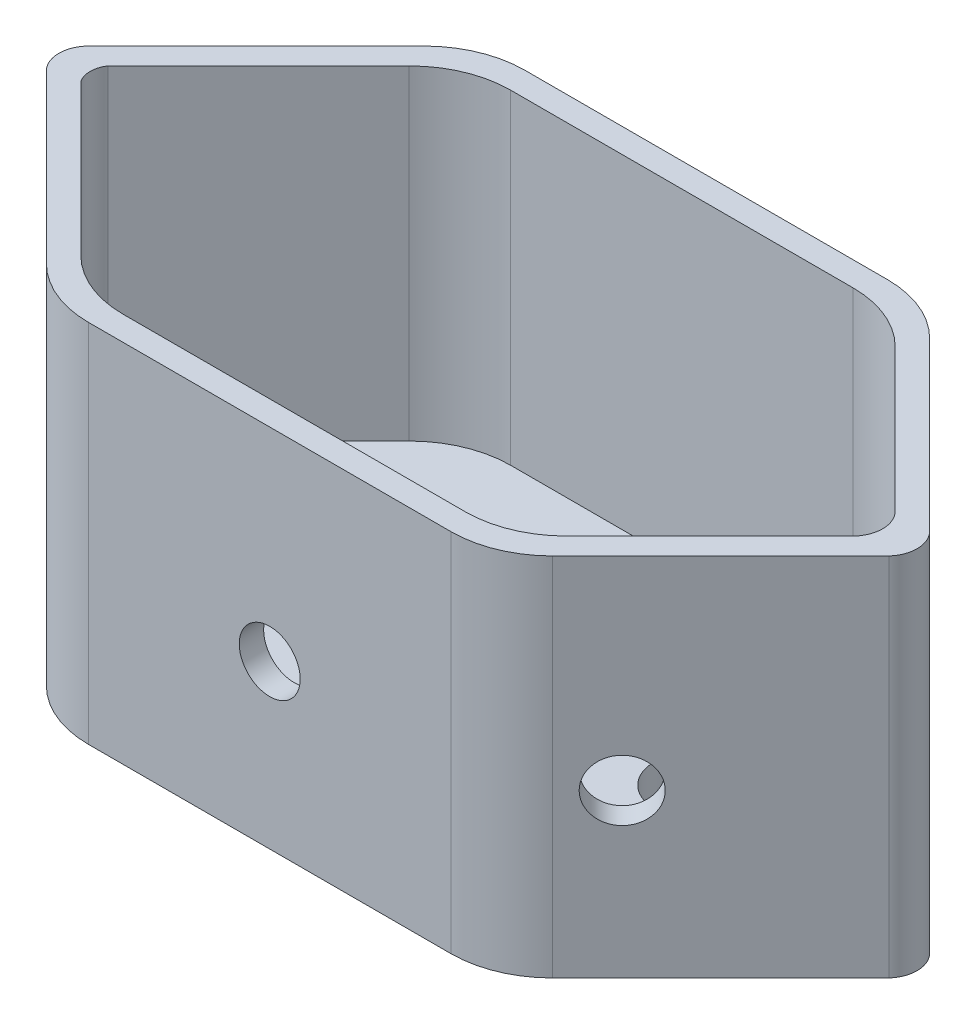
ISO-10303-21;
HEADER;
FILE_DESCRIPTION(('STEP AP214'),'2;1');
FILE_NAME('part.step','',(''),(''),'','','');
FILE_SCHEMA(('AUTOMOTIVE_DESIGN { 1 0 10303 214 1 1 1 1 }'));
ENDSEC;
DATA;
#1=APPLICATION_CONTEXT('core data for automotive mechanical design processes');
#2=APPLICATION_PROTOCOL_DEFINITION('international standard','automotive_design',2000,#1);
#3=PRODUCT_CONTEXT('',#1,'mechanical');
#4=PRODUCT('Part','Part','',(#3));
#5=PRODUCT_RELATED_PRODUCT_CATEGORY('part','',(#4));
#6=PRODUCT_DEFINITION_FORMATION('','',#4);
#7=PRODUCT_DEFINITION_CONTEXT('part definition',#1,'design');
#8=PRODUCT_DEFINITION('design','',#6,#7);
#9=PRODUCT_DEFINITION_SHAPE('','',#8);
#10=(LENGTH_UNIT() NAMED_UNIT(*) SI_UNIT(.MILLI.,.METRE.));
#11=(NAMED_UNIT(*) PLANE_ANGLE_UNIT() SI_UNIT($,.RADIAN.));
#12=(NAMED_UNIT(*) SI_UNIT($,.STERADIAN.) SOLID_ANGLE_UNIT());
#13=UNCERTAINTY_MEASURE_WITH_UNIT(LENGTH_MEASURE(1.E-05),#10,'distance_accuracy_value','');
#14=(GEOMETRIC_REPRESENTATION_CONTEXT(3) GLOBAL_UNCERTAINTY_ASSIGNED_CONTEXT((#13)) GLOBAL_UNIT_ASSIGNED_CONTEXT((#10,
#11,#12)) REPRESENTATION_CONTEXT('',''));
#15=CARTESIAN_POINT('',(0.,0.,0.));
#16=DIRECTION('',(0.,0.,1.));
#17=DIRECTION('',(1.,0.,0.));
#18=AXIS2_PLACEMENT_3D('',#15,#16,#17);
#19=CARTESIAN_POINT('',(8.92893218813522,18.,5.75000000000006));
#20=DIRECTION('',(0.,-1.,0.));
#21=DIRECTION('',(0.,0.,-1.));
#22=AXIS2_PLACEMENT_3D('',#19,#20,#21);
#23=CYLINDRICAL_SURFACE('',#22,5.);
#24=DIRECTION('',(0.,-1.,0.));
#25=VECTOR('',#24,1.);
#26=CARTESIAN_POINT('',(12.464466094068,18.,9.28553390593277));
#27=LINE('',#26,#25);
#28=CARTESIAN_POINT('',(12.464466094068,18.,9.28553390593277));
#29=VERTEX_POINT('',#28);
#30=CARTESIAN_POINT('',(12.464466094068,0.,9.28553390593277));
#31=VERTEX_POINT('',#30);
#32=EDGE_CURVE('E383',#29,#31,#27,.T.);
#33=ORIENTED_EDGE('',*,*,#32,.F.);
#34=CARTESIAN_POINT('',(8.92893218813522,18.,5.75000000000006));
#35=DIRECTION('',(0.,1.,0.));
#36=DIRECTION('',(0.,0.,1.));
#37=AXIS2_PLACEMENT_3D('',#34,#35,#36);
#38=CIRCLE('',#37,5.);
#39=CARTESIAN_POINT('',(8.92893218813522,18.,10.7500000000001));
#40=VERTEX_POINT('',#39);
#41=EDGE_CURVE('E41',#40,#29,#38,.T.);
#42=ORIENTED_EDGE('',*,*,#41,.F.);
#43=DIRECTION('',(0.,-1.,0.));
#44=VECTOR('',#43,1.);
#45=CARTESIAN_POINT('',(8.92893218813522,18.,10.7500000000001));
#46=LINE('',#45,#44);
#47=CARTESIAN_POINT('',(8.92893218813522,0.,10.7500000000001));
#48=VERTEX_POINT('',#47);
#49=EDGE_CURVE('E386',#48,#40,#46,.F.);
#50=ORIENTED_EDGE('',*,*,#49,.F.);
#51=CARTESIAN_POINT('',(8.92893218813522,0.,5.75000000000006));
#52=DIRECTION('',(0.,1.,0.));
#53=DIRECTION('',(0.,0.,1.));
#54=AXIS2_PLACEMENT_3D('',#51,#52,#53);
#55=CIRCLE('',#54,5.);
#56=EDGE_CURVE('E11',#31,#48,#55,.F.);
#57=ORIENTED_EDGE('',*,*,#56,.F.);
#58=EDGE_LOOP('',(#33,#42,#50,#57));
#59=FACE_BOUND('',#58,.T.);
#60=ADVANCED_FACE('F34',(#59),#23,.T.);
#61=CARTESIAN_POINT('',(-8.92893218813382,18.,5.75000000000006));
#62=DIRECTION('',(0.,-1.,0.));
#63=DIRECTION('',(0.,0.,-1.));
#64=AXIS2_PLACEMENT_3D('',#61,#62,#63);
#65=CYLINDRICAL_SURFACE('',#64,5.);
#66=DIRECTION('',(0.,-1.,0.));
#67=VECTOR('',#66,1.);
#68=CARTESIAN_POINT('',(-8.92893218813382,18.,10.7500000000001));
#69=LINE('',#68,#67);
#70=CARTESIAN_POINT('',(-8.92893218813382,18.,10.7500000000001));
#71=VERTEX_POINT('',#70);
#72=CARTESIAN_POINT('',(-8.92893218813382,0.,10.7500000000001));
#73=VERTEX_POINT('',#72);
#74=EDGE_CURVE('E373',#71,#73,#69,.T.);
#75=ORIENTED_EDGE('',*,*,#74,.F.);
#76=CARTESIAN_POINT('',(-8.92893218813382,18.,5.75000000000006));
#77=DIRECTION('',(0.,1.,0.));
#78=DIRECTION('',(0.,0.,1.));
#79=AXIS2_PLACEMENT_3D('',#76,#77,#78);
#80=CIRCLE('',#79,5.);
#81=CARTESIAN_POINT('',(-12.4644660940665,18.,9.28553390593282));
#82=VERTEX_POINT('',#81);
#83=EDGE_CURVE('E379',#82,#71,#80,.T.);
#84=ORIENTED_EDGE('',*,*,#83,.F.);
#85=DIRECTION('',(0.,-1.,0.));
#86=VECTOR('',#85,1.);
#87=CARTESIAN_POINT('',(-12.4644660940665,18.,9.28553390593282));
#88=LINE('',#87,#86);
#89=CARTESIAN_POINT('',(-12.4644660940665,0.,9.28553390593282));
#90=VERTEX_POINT('',#89);
#91=EDGE_CURVE('E376',#90,#82,#88,.F.);
#92=ORIENTED_EDGE('',*,*,#91,.F.);
#93=CARTESIAN_POINT('',(-8.92893218813382,0.,5.75000000000006));
#94=DIRECTION('',(0.,1.,0.));
#95=DIRECTION('',(0.,0.,1.));
#96=AXIS2_PLACEMENT_3D('',#93,#94,#95);
#97=CIRCLE('',#96,5.);
#98=EDGE_CURVE('E381',#73,#90,#97,.F.);
#99=ORIENTED_EDGE('',*,*,#98,.F.);
#100=EDGE_LOOP('',(#75,#84,#92,#99));
#101=FACE_BOUND('',#100,.T.);
#102=ADVANCED_FACE('F429',(#101),#65,.T.);
#103=CARTESIAN_POINT('',(8.92893218813454,18.,-5.74999999999998));
#104=DIRECTION('',(0.,1.,0.));
#105=DIRECTION('',(0.,0.,1.));
#106=AXIS2_PLACEMENT_3D('',#103,#104,#105);
#107=CYLINDRICAL_SURFACE('',#106,5.);
#108=DIRECTION('',(0.,-1.,0.));
#109=VECTOR('',#108,1.);
#110=CARTESIAN_POINT('',(8.92893218813453,18.,-10.75));
#111=LINE('',#110,#109);
#112=CARTESIAN_POINT('',(8.92893218813453,18.,-10.75));
#113=VERTEX_POINT('',#112);
#114=CARTESIAN_POINT('',(8.92893218813453,0.,-10.75));
#115=VERTEX_POINT('',#114);
#116=EDGE_CURVE('E363',#113,#115,#111,.T.);
#117=ORIENTED_EDGE('',*,*,#116,.F.);
#118=CARTESIAN_POINT('',(8.92893218813454,18.,-5.74999999999998));
#119=DIRECTION('',(0.,1.,0.));
#120=DIRECTION('',(0.,0.,1.));
#121=AXIS2_PLACEMENT_3D('',#118,#119,#120);
#122=CIRCLE('',#121,5.);
#123=CARTESIAN_POINT('',(12.4644660940673,18.,-9.28553390593274));
#124=VERTEX_POINT('',#123);
#125=EDGE_CURVE('E369',#124,#113,#122,.T.);
#126=ORIENTED_EDGE('',*,*,#125,.F.);
#127=DIRECTION('',(0.,-1.,0.));
#128=VECTOR('',#127,1.);
#129=CARTESIAN_POINT('',(12.4644660940673,18.,-9.28553390593274));
#130=LINE('',#129,#128);
#131=CARTESIAN_POINT('',(12.4644660940673,0.,-9.28553390593274));
#132=VERTEX_POINT('',#131);
#133=EDGE_CURVE('E366',#132,#124,#130,.F.);
#134=ORIENTED_EDGE('',*,*,#133,.F.);
#135=CARTESIAN_POINT('',(8.92893218813454,0.,-5.74999999999998));
#136=DIRECTION('',(0.,1.,0.));
#137=DIRECTION('',(0.,0.,1.));
#138=AXIS2_PLACEMENT_3D('',#135,#136,#137);
#139=CIRCLE('',#138,5.);
#140=EDGE_CURVE('E371',#115,#132,#139,.F.);
#141=ORIENTED_EDGE('',*,*,#140,.F.);
#142=EDGE_LOOP('',(#117,#126,#134,#141));
#143=FACE_BOUND('',#142,.T.);
#144=ADVANCED_FACE('F406',(#143),#107,.T.);
#145=CARTESIAN_POINT('',(-8.92893218813485,18.,-5.74999999999995));
#146=DIRECTION('',(0.,1.,0.));
#147=DIRECTION('',(0.,0.,1.));
#148=AXIS2_PLACEMENT_3D('',#145,#146,#147);
#149=CYLINDRICAL_SURFACE('',#148,5.);
#150=DIRECTION('',(0.,1.,0.));
#151=VECTOR('',#150,1.);
#152=CARTESIAN_POINT('',(-8.92893218813486,18.,-10.7499999999999));
#153=LINE('',#152,#151);
#154=CARTESIAN_POINT('',(-8.92893218813486,0.,-10.7499999999999));
#155=VERTEX_POINT('',#154);
#156=CARTESIAN_POINT('',(-8.92893218813486,18.,-10.7499999999999));
#157=VERTEX_POINT('',#156);
#158=EDGE_CURVE('E353',#155,#157,#153,.T.);
#159=ORIENTED_EDGE('',*,*,#158,.F.);
#160=CARTESIAN_POINT('',(-8.92893218813485,0.,-5.74999999999995));
#161=DIRECTION('',(0.,1.,0.));
#162=DIRECTION('',(0.,0.,1.));
#163=AXIS2_PLACEMENT_3D('',#160,#161,#162);
#164=CIRCLE('',#163,5.);
#165=CARTESIAN_POINT('',(-12.4644660940676,0.,-9.28553390593266));
#166=VERTEX_POINT('',#165);
#167=EDGE_CURVE('E359',#166,#155,#164,.F.);
#168=ORIENTED_EDGE('',*,*,#167,.F.);
#169=DIRECTION('',(0.,1.,0.));
#170=VECTOR('',#169,1.);
#171=CARTESIAN_POINT('',(-12.4644660940676,18.,-9.28553390593266));
#172=LINE('',#171,#170);
#173=CARTESIAN_POINT('',(-12.4644660940676,18.,-9.28553390593266));
#174=VERTEX_POINT('',#173);
#175=EDGE_CURVE('E356',#174,#166,#172,.F.);
#176=ORIENTED_EDGE('',*,*,#175,.F.);
#177=CARTESIAN_POINT('',(-8.92893218813485,18.,-5.74999999999995));
#178=DIRECTION('',(0.,1.,0.));
#179=DIRECTION('',(0.,0.,1.));
#180=AXIS2_PLACEMENT_3D('',#177,#178,#179);
#181=CIRCLE('',#180,5.);
#182=EDGE_CURVE('E361',#157,#174,#181,.T.);
#183=ORIENTED_EDGE('',*,*,#182,.F.);
#184=EDGE_LOOP('',(#159,#168,#176,#183));
#185=FACE_BOUND('',#184,.T.);
#186=ADVANCED_FACE('F415',(#185),#149,.T.);
#187=CARTESIAN_POINT('',(8.43187591328753,2.,4.55000000000006));
#188=DIRECTION('',(0.,-1.,0.));
#189=DIRECTION('',(0.,0.,-1.));
#190=AXIS2_PLACEMENT_3D('',#187,#188,#189);
#191=CYLINDRICAL_SURFACE('',#190,5.);
#192=DIRECTION('',(0.,-1.,0.));
#193=VECTOR('',#192,1.);
#194=CARTESIAN_POINT('',(8.43187591328753,2.,9.55000000000006));
#195=LINE('',#194,#193);
#196=CARTESIAN_POINT('',(8.43187591328753,18.,9.55000000000006));
#197=VERTEX_POINT('',#196);
#198=CARTESIAN_POINT('',(8.43187591328753,2.,9.55000000000006));
#199=VERTEX_POINT('',#198);
#200=EDGE_CURVE('E343',#197,#199,#195,.T.);
#201=ORIENTED_EDGE('',*,*,#200,.F.);
#202=CARTESIAN_POINT('',(8.43187591328753,18.,4.55000000000006));
#203=DIRECTION('',(0.,1.,0.));
#204=DIRECTION('',(0.,0.,1.));
#205=AXIS2_PLACEMENT_3D('',#202,#203,#204);
#206=CIRCLE('',#205,5.);
#207=CARTESIAN_POINT('',(11.9674098192203,18.,8.0855339059328));
#208=VERTEX_POINT('',#207);
#209=EDGE_CURVE('E351',#197,#208,#206,.T.);
#210=ORIENTED_EDGE('',*,*,#209,.T.);
#211=DIRECTION('',(0.,-1.,0.));
#212=VECTOR('',#211,1.);
#213=CARTESIAN_POINT('',(11.9674098192203,2.,8.08553390593279));
#214=LINE('',#213,#212);
#215=CARTESIAN_POINT('',(11.9674098192203,2.,8.0855339059328));
#216=VERTEX_POINT('',#215);
#217=EDGE_CURVE('E346',#216,#208,#214,.F.);
#218=ORIENTED_EDGE('',*,*,#217,.F.);
#219=CARTESIAN_POINT('',(8.43187591328753,2.,4.55000000000006));
#220=DIRECTION('',(0.,1.,0.));
#221=DIRECTION('',(0.,0.,1.));
#222=AXIS2_PLACEMENT_3D('',#219,#220,#221);
#223=CIRCLE('',#222,5.);
#224=EDGE_CURVE('E349',#199,#216,#223,.T.);
#225=ORIENTED_EDGE('',*,*,#224,.F.);
#226=EDGE_LOOP('',(#201,#210,#218,#225));
#227=FACE_BOUND('',#226,.T.);
#228=ADVANCED_FACE('F457',(#227),#191,.F.);
#229=CARTESIAN_POINT('',(-8.43187591328621,2.,4.55000000000006));
#230=DIRECTION('',(0.,-1.,0.));
#231=DIRECTION('',(0.,0.,-1.));
#232=AXIS2_PLACEMENT_3D('',#229,#230,#231);
#233=CYLINDRICAL_SURFACE('',#232,5.);
#234=DIRECTION('',(0.,-1.,0.));
#235=VECTOR('',#234,1.);
#236=CARTESIAN_POINT('',(-11.9674098192189,2.,8.0855339059328));
#237=LINE('',#236,#235);
#238=CARTESIAN_POINT('',(-11.9674098192189,18.,8.0855339059328));
#239=VERTEX_POINT('',#238);
#240=CARTESIAN_POINT('',(-11.9674098192189,2.,8.0855339059328));
#241=VERTEX_POINT('',#240);
#242=EDGE_CURVE('E333',#239,#241,#237,.T.);
#243=ORIENTED_EDGE('',*,*,#242,.F.);
#244=CARTESIAN_POINT('',(-8.43187591328621,18.,4.55000000000006));
#245=DIRECTION('',(0.,1.,0.));
#246=DIRECTION('',(0.,0.,1.));
#247=AXIS2_PLACEMENT_3D('',#244,#245,#246);
#248=CIRCLE('',#247,5.);
#249=CARTESIAN_POINT('',(-8.43187591328621,18.,9.55000000000006));
#250=VERTEX_POINT('',#249);
#251=EDGE_CURVE('E341',#239,#250,#248,.T.);
#252=ORIENTED_EDGE('',*,*,#251,.T.);
#253=DIRECTION('',(0.,-1.,0.));
#254=VECTOR('',#253,1.);
#255=CARTESIAN_POINT('',(-8.43187591328621,2.,9.55000000000006));
#256=LINE('',#255,#254);
#257=CARTESIAN_POINT('',(-8.43187591328621,2.,9.55000000000006));
#258=VERTEX_POINT('',#257);
#259=EDGE_CURVE('E336',#258,#250,#256,.F.);
#260=ORIENTED_EDGE('',*,*,#259,.F.);
#261=CARTESIAN_POINT('',(-8.43187591328621,2.,4.55000000000006));
#262=DIRECTION('',(0.,1.,0.));
#263=DIRECTION('',(0.,0.,1.));
#264=AXIS2_PLACEMENT_3D('',#261,#262,#263);
#265=CIRCLE('',#264,5.);
#266=EDGE_CURVE('E339',#241,#258,#265,.T.);
#267=ORIENTED_EDGE('',*,*,#266,.F.);
#268=EDGE_LOOP('',(#243,#252,#260,#267));
#269=FACE_BOUND('',#268,.T.);
#270=ADVANCED_FACE('F460',(#269),#233,.F.);
#271=CARTESIAN_POINT('',(8.43187591328693,2.,-4.54999999999994));
#272=DIRECTION('',(0.,-1.,0.));
#273=DIRECTION('',(0.,0.,-1.));
#274=AXIS2_PLACEMENT_3D('',#271,#272,#273);
#275=CYLINDRICAL_SURFACE('',#274,5.);
#276=DIRECTION('',(0.,1.,0.));
#277=VECTOR('',#276,1.);
#278=CARTESIAN_POINT('',(8.43187591328693,2.,-9.54999999999994));
#279=LINE('',#278,#277);
#280=CARTESIAN_POINT('',(8.43187591328693,2.,-9.54999999999994));
#281=VERTEX_POINT('',#280);
#282=CARTESIAN_POINT('',(8.43187591328693,18.,-9.54999999999994));
#283=VERTEX_POINT('',#282);
#284=EDGE_CURVE('E325',#281,#283,#279,.T.);
#285=ORIENTED_EDGE('',*,*,#284,.F.);
#286=CARTESIAN_POINT('',(8.43187591328693,2.,-4.54999999999994));
#287=DIRECTION('',(0.,1.,0.));
#288=DIRECTION('',(0.,0.,1.));
#289=AXIS2_PLACEMENT_3D('',#286,#287,#288);
#290=CIRCLE('',#289,5.);
#291=CARTESIAN_POINT('',(11.9674098192197,2.,-8.08553390593268));
#292=VERTEX_POINT('',#291);
#293=EDGE_CURVE('E329',#292,#281,#290,.T.);
#294=ORIENTED_EDGE('',*,*,#293,.F.);
#295=DIRECTION('',(0.,1.,0.));
#296=VECTOR('',#295,1.);
#297=CARTESIAN_POINT('',(11.9674098192197,2.,-8.08553390593268));
#298=LINE('',#297,#296);
#299=CARTESIAN_POINT('',(11.9674098192197,18.,-8.08553390593268));
#300=VERTEX_POINT('',#299);
#301=EDGE_CURVE('E218',#300,#292,#298,.F.);
#302=ORIENTED_EDGE('',*,*,#301,.F.);
#303=CARTESIAN_POINT('',(8.43187591328693,18.,-4.54999999999994));
#304=DIRECTION('',(0.,1.,0.));
#305=DIRECTION('',(0.,0.,1.));
#306=AXIS2_PLACEMENT_3D('',#303,#304,#305);
#307=CIRCLE('',#306,5.);
#308=EDGE_CURVE('E331',#300,#283,#307,.T.);
#309=ORIENTED_EDGE('',*,*,#308,.T.);
#310=EDGE_LOOP('',(#285,#294,#302,#309));
#311=FACE_BOUND('',#310,.T.);
#312=ADVANCED_FACE('F464',(#311),#275,.F.);
#313=CARTESIAN_POINT('',(-8.43187591328704,2.,-4.54999999999994));
#314=DIRECTION('',(0.,-1.,0.));
#315=DIRECTION('',(0.,0.,-1.));
#316=AXIS2_PLACEMENT_3D('',#313,#314,#315);
#317=CYLINDRICAL_SURFACE('',#316,5.);
#318=DIRECTION('',(0.,-1.,0.));
#319=VECTOR('',#318,1.);
#320=CARTESIAN_POINT('',(-8.43187591328704,2.,-9.54999999999994));
#321=LINE('',#320,#319);
#322=CARTESIAN_POINT('',(-8.43187591328704,18.,-9.54999999999994));
#323=VERTEX_POINT('',#322);
#324=CARTESIAN_POINT('',(-8.43187591328704,2.,-9.54999999999994));
#325=VERTEX_POINT('',#324);
#326=EDGE_CURVE('E315',#323,#325,#321,.T.);
#327=ORIENTED_EDGE('',*,*,#326,.F.);
#328=CARTESIAN_POINT('',(-8.43187591328704,18.,-4.54999999999994));
#329=DIRECTION('',(0.,1.,0.));
#330=DIRECTION('',(0.,0.,1.));
#331=AXIS2_PLACEMENT_3D('',#328,#329,#330);
#332=CIRCLE('',#331,5.);
#333=CARTESIAN_POINT('',(-11.9674098192198,18.,-8.08553390593268));
#334=VERTEX_POINT('',#333);
#335=EDGE_CURVE('E323',#323,#334,#332,.T.);
#336=ORIENTED_EDGE('',*,*,#335,.T.);
#337=DIRECTION('',(0.,-1.,0.));
#338=VECTOR('',#337,1.);
#339=CARTESIAN_POINT('',(-11.9674098192198,2.,-8.08553390593268));
#340=LINE('',#339,#338);
#341=CARTESIAN_POINT('',(-11.9674098192198,2.,-8.08553390593268));
#342=VERTEX_POINT('',#341);
#343=EDGE_CURVE('E318',#342,#334,#340,.F.);
#344=ORIENTED_EDGE('',*,*,#343,.F.);
#345=CARTESIAN_POINT('',(-8.43187591328704,2.,-4.54999999999994));
#346=DIRECTION('',(0.,1.,0.));
#347=DIRECTION('',(0.,0.,1.));
#348=AXIS2_PLACEMENT_3D('',#345,#346,#347);
#349=CIRCLE('',#348,5.);
#350=EDGE_CURVE('E321',#325,#342,#349,.T.);
#351=ORIENTED_EDGE('',*,*,#350,.F.);
#352=EDGE_LOOP('',(#327,#336,#344,#351));
#353=FACE_BOUND('',#352,.T.);
#354=ADVANCED_FACE('F468',(#353),#317,.F.);
#355=CARTESIAN_POINT('',(0.,18.,0.));
#356=DIRECTION('',(0.,1.,0.));
#357=DIRECTION('',(0.,0.,1.));
#358=AXIS2_PLACEMENT_3D('',#355,#356,#357);
#359=PLANE('',#358);
#360=ORIENTED_EDGE('',*,*,#251,.F.);
#361=DIRECTION('',(-0.707106781186548,0.,-0.707106781186547));
#362=VECTOR('',#361,1.);
#363=CARTESIAN_POINT('',(-10.0264718625759,18.,10.0264718625759));
#364=LINE('',#363,#362);
#365=CARTESIAN_POINT('',(-19.389618767081,18.,0.663324958070733));
#366=VERTEX_POINT('',#365);
#367=EDGE_CURVE('E247',#239,#366,#364,.T.);
#368=ORIENTED_EDGE('',*,*,#367,.T.);
#369=CARTESIAN_POINT('',(-18.389618767081,18.,-3.56702514747731E-13));
#370=DIRECTION('',(0.,1.,0.));
#371=DIRECTION('',(0.,0.,1.));
#372=AXIS2_PLACEMENT_3D('',#369,#370,#371);
#373=CIRCLE('',#372,1.2);
#374=CARTESIAN_POINT('',(-19.389618767081,18.,-0.663324958071436));
#375=VERTEX_POINT('',#374);
#376=EDGE_CURVE('E244',#375,#366,#373,.T.);
#377=ORIENTED_EDGE('',*,*,#376,.F.);
#378=DIRECTION('',(0.707106781186548,0.,-0.707106781186547));
#379=VECTOR('',#378,1.);
#380=CARTESIAN_POINT('',(-10.0264718625762,18.,-10.0264718625762));
#381=LINE('',#380,#379);
#382=EDGE_CURVE('E241',#375,#334,#381,.T.);
#383=ORIENTED_EDGE('',*,*,#382,.T.);
#384=ORIENTED_EDGE('',*,*,#335,.F.);
#385=DIRECTION('',(-1.,0.,0.));
#386=VECTOR('',#385,1.);
#387=CARTESIAN_POINT('',(0.,18.,-9.54999999999994));
#388=LINE('',#387,#386);
#389=EDGE_CURVE('E239',#283,#323,#388,.T.);
#390=ORIENTED_EDGE('',*,*,#389,.F.);
#391=ORIENTED_EDGE('',*,*,#308,.F.);
#392=DIRECTION('',(-0.707106781186548,0.,-0.707106781186548));
#393=VECTOR('',#392,1.);
#394=CARTESIAN_POINT('',(10.0264718625762,18.,-10.0264718625762));
#395=LINE('',#394,#393);
#396=CARTESIAN_POINT('',(19.0529437251527,18.,-0.999999999999645));
#397=VERTEX_POINT('',#396);
#398=EDGE_CURVE('E236',#397,#300,#395,.T.);
#399=ORIENTED_EDGE('',*,*,#398,.F.);
#400=CARTESIAN_POINT('',(17.9349097364028,18.,3.55076211489003E-13));
#401=DIRECTION('',(0.,1.,0.));
#402=DIRECTION('',(0.,0.,1.));
#403=AXIS2_PLACEMENT_3D('',#400,#401,#402);
#404=CIRCLE('',#403,1.5);
#405=CARTESIAN_POINT('',(19.0529437251527,18.,1.00000000000035));
#406=VERTEX_POINT('',#405);
#407=EDGE_CURVE('E199',#397,#406,#404,.F.);
#408=ORIENTED_EDGE('',*,*,#407,.T.);
#409=DIRECTION('',(-0.707106781186547,0.,0.707106781186548));
#410=VECTOR('',#409,1.);
#411=CARTESIAN_POINT('',(10.0264718625765,18.,10.0264718625765));
#412=LINE('',#411,#410);
#413=EDGE_CURVE('E213',#406,#208,#412,.T.);
#414=ORIENTED_EDGE('',*,*,#413,.T.);
#415=ORIENTED_EDGE('',*,*,#209,.F.);
#416=DIRECTION('',(1.,0.,0.));
#417=VECTOR('',#416,1.);
#418=CARTESIAN_POINT('',(0.,18.,9.55000000000006));
#419=LINE('',#418,#417);
#420=EDGE_CURVE('E249',#250,#197,#419,.T.);
#421=ORIENTED_EDGE('',*,*,#420,.F.);
#422=EDGE_LOOP('',(#360,#368,#377,#383,#384,#390,#391,#399,#408,#414,#415,#421));
#423=FACE_BOUND('',#422,.T.);
#424=DIRECTION('',(1.,0.,0.));
#425=VECTOR('',#424,1.);
#426=CARTESIAN_POINT('',(0.,18.,10.7500000000001));
#427=LINE('',#426,#425);
#428=EDGE_CURVE('E268',#71,#40,#427,.T.);
#429=ORIENTED_EDGE('',*,*,#428,.T.);
#430=ORIENTED_EDGE('',*,*,#41,.T.);
#431=DIRECTION('',(0.707106781186543,0.,-0.707106781186552));
#432=VECTOR('',#431,1.);
#433=CARTESIAN_POINT('',(10.8750000000005,18.,10.8750000000003));
#434=LINE('',#433,#432);
#435=CARTESIAN_POINT('',(20.750111132589,18.,0.999888867411659));
#436=VERTEX_POINT('',#435);
#437=EDGE_CURVE('E271',#29,#436,#434,.T.);
#438=ORIENTED_EDGE('',*,*,#437,.T.);
#439=CARTESIAN_POINT('',(19.6319660112503,18.,0.));
#440=DIRECTION('',(0.,1.,0.));
#441=DIRECTION('',(0.,0.,1.));
#442=AXIS2_PLACEMENT_3D('',#439,#440,#441);
#443=CIRCLE('',#442,1.50000000000017);
#444=CARTESIAN_POINT('',(20.7500000000002,18.,-0.999999999999879));
#445=VERTEX_POINT('',#444);
#446=EDGE_CURVE('E273',#445,#436,#443,.F.);
#447=ORIENTED_EDGE('',*,*,#446,.F.);
#448=DIRECTION('',(-0.70710678118655,0.,-0.707106781186545));
#449=VECTOR('',#448,1.);
#450=CARTESIAN_POINT('',(10.875,18.,-10.875));
#451=LINE('',#450,#449);
#452=EDGE_CURVE('E276',#445,#124,#451,.T.);
#453=ORIENTED_EDGE('',*,*,#452,.T.);
#454=ORIENTED_EDGE('',*,*,#125,.T.);
#455=DIRECTION('',(1.,0.,0.));
#456=VECTOR('',#455,1.);
#457=CARTESIAN_POINT('',(0.,18.,-10.75));
#458=LINE('',#457,#456);
#459=EDGE_CURVE('E279',#157,#113,#458,.T.);
#460=ORIENTED_EDGE('',*,*,#459,.F.);
#461=ORIENTED_EDGE('',*,*,#182,.T.);
#462=DIRECTION('',(0.707106781186543,0.,-0.707106781186552));
#463=VECTOR('',#462,1.);
#464=CARTESIAN_POINT('',(-10.8750000000002,18.,-10.8750000000001));
#465=LINE('',#464,#463);
#466=CARTESIAN_POINT('',(-20.7500000000001,18.,-1.00000000000011));
#467=VERTEX_POINT('',#466);
#468=EDGE_CURVE('E282',#467,#174,#465,.T.);
#469=ORIENTED_EDGE('',*,*,#468,.F.);
#470=CARTESIAN_POINT('',(-19.6320417686495,18.,-5.06867402993033E-05));
#471=DIRECTION('',(0.,1.,0.));
#472=DIRECTION('',(0.,0.,1.));
#473=AXIS2_PLACEMENT_3D('',#470,#471,#472);
#474=CIRCLE('',#473,1.49990974266231);
#475=CARTESIAN_POINT('',(-20.7491338665618,18.,1.00086613343768));
#476=VERTEX_POINT('',#475);
#477=EDGE_CURVE('E261',#476,#467,#474,.F.);
#478=ORIENTED_EDGE('',*,*,#477,.F.);
#479=DIRECTION('',(0.707106781186552,0.,0.707106781186543));
#480=VECTOR('',#479,1.);
#481=CARTESIAN_POINT('',(-10.8749999999996,18.,10.8749999999997));
#482=LINE('',#481,#480);
#483=EDGE_CURVE('E264',#476,#82,#482,.T.);
#484=ORIENTED_EDGE('',*,*,#483,.T.);
#485=ORIENTED_EDGE('',*,*,#83,.T.);
#486=EDGE_LOOP('',(#429,#430,#438,#447,#453,#454,#460,#461,#469,#478,#484,#485));
#487=FACE_BOUND('',#486,.T.);
#488=ADVANCED_FACE('F388',(#423,#487),#359,.T.);
#489=CARTESIAN_POINT('',(-19.6320417686495,18.,-5.06867402993033E-05));
#490=DIRECTION('',(0.,-1.,0.));
#491=DIRECTION('',(0.,0.,-1.));
#492=AXIS2_PLACEMENT_3D('',#489,#490,#491);
#493=CYLINDRICAL_SURFACE('',#492,1.49990974266231);
#494=CARTESIAN_POINT('',(-19.6320417686495,0.,-5.06867402993033E-05));
#495=DIRECTION('',(0.,1.,0.));
#496=DIRECTION('',(0.,0.,1.));
#497=AXIS2_PLACEMENT_3D('',#494,#495,#496);
#498=CIRCLE('',#497,1.49990974266231);
#499=CARTESIAN_POINT('',(-20.7491338665618,0.,1.00086613343768));
#500=VERTEX_POINT('',#499);
#501=CARTESIAN_POINT('',(-20.7500000000001,0.,-1.00000000000011));
#502=VERTEX_POINT('',#501);
#503=EDGE_CURVE('E256',#500,#502,#498,.F.);
#504=ORIENTED_EDGE('',*,*,#503,.F.);
#505=DIRECTION('',(0.,-1.,0.));
#506=VECTOR('',#505,1.);
#507=CARTESIAN_POINT('',(-20.7491338665618,18.,1.00086613343768));
#508=LINE('',#507,#506);
#509=EDGE_CURVE('E313',#476,#500,#508,.T.);
#510=ORIENTED_EDGE('',*,*,#509,.F.);
#511=ORIENTED_EDGE('',*,*,#477,.T.);
#512=DIRECTION('',(0.,-1.,0.));
#513=VECTOR('',#512,1.);
#514=CARTESIAN_POINT('',(-20.7500000000001,18.,-1.00000000000011));
#515=LINE('',#514,#513);
#516=EDGE_CURVE('E285',#467,#502,#515,.T.);
#517=ORIENTED_EDGE('',*,*,#516,.T.);
#518=EDGE_LOOP('',(#504,#510,#511,#517));
#519=FACE_BOUND('',#518,.T.);
#520=ADVANCED_FACE('F421',(#519),#493,.T.);
#521=CARTESIAN_POINT('',(-10.8749999999996,18.,10.8749999999997));
#522=DIRECTION('',(0.707106781186543,0.,-0.707106781186552));
#523=DIRECTION('',(-0.707106781186552,0.,-0.707106781186543));
#524=AXIS2_PLACEMENT_3D('',#521,#522,#523);
#525=PLANE('',#524);
#526=CARTESIAN_POINT('',(-14.1798989873217,8.,7.57010101267768));
#527=DIRECTION('',(0.707106781186543,0.,-0.707106781186552));
#528=DIRECTION('',(-0.707106781186552,0.,-0.707106781186543));
#529=AXIS2_PLACEMENT_3D('',#526,#527,#528);
#530=CIRCLE('',#529,1.5);
#531=CARTESIAN_POINT('',(-15.2405591591015,8.,6.50944084089787));
#532=VERTEX_POINT('',#531);
#533=EDGE_CURVE('E841',#532,#532,#530,.T.);
#534=ORIENTED_EDGE('',*,*,#533,.T.);
#535=EDGE_LOOP('',(#534));
#536=FACE_BOUND('',#535,.T.);
#537=DIRECTION('',(0.707106781186552,0.,0.707106781186543));
#538=VECTOR('',#537,1.);
#539=CARTESIAN_POINT('',(-10.8749999999996,0.,10.8749999999997));
#540=LINE('',#539,#538);
#541=EDGE_CURVE('E288',#500,#90,#540,.T.);
#542=ORIENTED_EDGE('',*,*,#541,.T.);
#543=ORIENTED_EDGE('',*,*,#91,.T.);
#544=ORIENTED_EDGE('',*,*,#483,.F.);
#545=ORIENTED_EDGE('',*,*,#509,.T.);
#546=EDGE_LOOP('',(#542,#543,#544,#545));
#547=FACE_BOUND('',#546,.T.);
#548=ADVANCED_FACE('F425',(#536,#547),#525,.F.);
#549=CARTESIAN_POINT('',(0.,18.,10.7500000000001));
#550=DIRECTION('',(0.,0.,-1.));
#551=DIRECTION('',(-1.,0.,0.));
#552=AXIS2_PLACEMENT_3D('',#549,#550,#551);
#553=PLANE('',#552);
#554=CARTESIAN_POINT('',(-1.11593485369136E-12,8.,10.7500000000001));
#555=DIRECTION('',(0.,0.,-1.));
#556=DIRECTION('',(-1.,0.,0.));
#557=AXIS2_PLACEMENT_3D('',#554,#555,#556);
#558=CIRCLE('',#557,1.5);
#559=CARTESIAN_POINT('',(-1.50000000000112,8.,10.7500000000001));
#560=VERTEX_POINT('',#559);
#561=EDGE_CURVE('E237',#560,#560,#558,.T.);
#562=ORIENTED_EDGE('',*,*,#561,.T.);
#563=EDGE_LOOP('',(#562));
#564=FACE_BOUND('',#563,.T.);
#565=DIRECTION('',(1.,0.,0.));
#566=VECTOR('',#565,1.);
#567=CARTESIAN_POINT('',(0.,0.,10.7500000000001));
#568=LINE('',#567,#566);
#569=EDGE_CURVE('E291',#73,#48,#568,.T.);
#570=ORIENTED_EDGE('',*,*,#569,.T.);
#571=ORIENTED_EDGE('',*,*,#49,.T.);
#572=ORIENTED_EDGE('',*,*,#428,.F.);
#573=ORIENTED_EDGE('',*,*,#74,.T.);
#574=EDGE_LOOP('',(#570,#571,#572,#573));
#575=FACE_BOUND('',#574,.T.);
#576=ADVANCED_FACE('F431',(#564,#575),#553,.F.);
#577=CARTESIAN_POINT('',(10.8750000000005,18.,10.8750000000003));
#578=DIRECTION('',(-0.707106781186552,0.,-0.707106781186543));
#579=DIRECTION('',(-0.707106781186543,0.,0.707106781186552));
#580=AXIS2_PLACEMENT_3D('',#577,#578,#579);
#581=PLANE('',#580);
#582=CARTESIAN_POINT('',(14.179898987323,8.,7.5701010126777));
#583=DIRECTION('',(-0.707106781186552,0.,-0.707106781186543));
#584=DIRECTION('',(-0.707106781186543,0.,0.707106781186552));
#585=AXIS2_PLACEMENT_3D('',#582,#583,#584);
#586=CIRCLE('',#585,1.5);
#587=CARTESIAN_POINT('',(13.1192388155432,8.,8.63076118445753));
#588=VERTEX_POINT('',#587);
#589=EDGE_CURVE('E847',#588,#588,#586,.T.);
#590=ORIENTED_EDGE('',*,*,#589,.T.);
#591=EDGE_LOOP('',(#590));
#592=FACE_BOUND('',#591,.T.);
#593=ORIENTED_EDGE('',*,*,#437,.F.);
#594=ORIENTED_EDGE('',*,*,#32,.T.);
#595=DIRECTION('',(0.707106781186543,0.,-0.707106781186552));
#596=VECTOR('',#595,1.);
#597=CARTESIAN_POINT('',(10.8750000000005,0.,10.8750000000003));
#598=LINE('',#597,#596);
#599=CARTESIAN_POINT('',(20.750111132589,0.,0.999888867411659));
#600=VERTEX_POINT('',#599);
#601=EDGE_CURVE('E294',#31,#600,#598,.T.);
#602=ORIENTED_EDGE('',*,*,#601,.T.);
#603=DIRECTION('',(0.,-1.,0.));
#604=VECTOR('',#603,1.);
#605=CARTESIAN_POINT('',(20.750111132589,18.,0.999888867411659));
#606=LINE('',#605,#604);
#607=EDGE_CURVE('E310',#436,#600,#606,.T.);
#608=ORIENTED_EDGE('',*,*,#607,.F.);
#609=EDGE_LOOP('',(#593,#594,#602,#608));
#610=FACE_BOUND('',#609,.T.);
#611=ADVANCED_FACE('F394',(#592,#610),#581,.F.);
#612=CARTESIAN_POINT('',(19.6319660112503,18.,0.));
#613=DIRECTION('',(0.,-1.,0.));
#614=DIRECTION('',(0.,0.,-1.));
#615=AXIS2_PLACEMENT_3D('',#612,#613,#614);
#616=CYLINDRICAL_SURFACE('',#615,1.50000000000017);
#617=CARTESIAN_POINT('',(19.6319660112503,0.,0.));
#618=DIRECTION('',(0.,1.,0.));
#619=DIRECTION('',(0.,0.,1.));
#620=AXIS2_PLACEMENT_3D('',#617,#618,#619);
#621=CIRCLE('',#620,1.50000000000017);
#622=CARTESIAN_POINT('',(20.7500000000002,0.,-0.999999999999879));
#623=VERTEX_POINT('',#622);
#624=EDGE_CURVE('E296',#623,#600,#621,.F.);
#625=ORIENTED_EDGE('',*,*,#624,.F.);
#626=DIRECTION('',(0.,-1.,0.));
#627=VECTOR('',#626,1.);
#628=CARTESIAN_POINT('',(20.7500000000002,18.,-0.999999999999879));
#629=LINE('',#628,#627);
#630=EDGE_CURVE('E308',#445,#623,#629,.T.);
#631=ORIENTED_EDGE('',*,*,#630,.F.);
#632=ORIENTED_EDGE('',*,*,#446,.T.);
#633=ORIENTED_EDGE('',*,*,#607,.T.);
#634=EDGE_LOOP('',(#625,#631,#632,#633));
#635=FACE_BOUND('',#634,.T.);
#636=ADVANCED_FACE('F397',(#635),#616,.T.);
#637=CARTESIAN_POINT('',(10.875,18.,-10.875));
#638=DIRECTION('',(-0.707106781186545,0.,0.70710678118655));
#639=DIRECTION('',(0.70710678118655,0.,0.707106781186545));
#640=AXIS2_PLACEMENT_3D('',#637,#638,#639);
#641=PLANE('',#640);
#642=DIRECTION('',(-0.70710678118655,0.,-0.707106781186545));
#643=VECTOR('',#642,1.);
#644=CARTESIAN_POINT('',(10.875,0.,-10.875));
#645=LINE('',#644,#643);
#646=EDGE_CURVE('E299',#623,#132,#645,.T.);
#647=ORIENTED_EDGE('',*,*,#646,.T.);
#648=ORIENTED_EDGE('',*,*,#133,.T.);
#649=ORIENTED_EDGE('',*,*,#452,.F.);
#650=ORIENTED_EDGE('',*,*,#630,.T.);
#651=EDGE_LOOP('',(#647,#648,#649,#650));
#652=FACE_BOUND('',#651,.T.);
#653=ADVANCED_FACE('F402',(#652),#641,.F.);
#654=CARTESIAN_POINT('',(0.,18.,-10.75));
#655=DIRECTION('',(0.,0.,-1.));
#656=DIRECTION('',(-1.,0.,0.));
#657=AXIS2_PLACEMENT_3D('',#654,#655,#656);
#658=PLANE('',#657);
#659=ORIENTED_EDGE('',*,*,#459,.T.);
#660=ORIENTED_EDGE('',*,*,#116,.T.);
#661=DIRECTION('',(1.,0.,0.));
#662=VECTOR('',#661,1.);
#663=CARTESIAN_POINT('',(0.,0.,-10.75));
#664=LINE('',#663,#662);
#665=EDGE_CURVE('E302',#155,#115,#664,.T.);
#666=ORIENTED_EDGE('',*,*,#665,.F.);
#667=ORIENTED_EDGE('',*,*,#158,.T.);
#668=EDGE_LOOP('',(#659,#660,#666,#667));
#669=FACE_BOUND('',#668,.T.);
#670=ADVANCED_FACE('F409',(#669),#658,.T.);
#671=CARTESIAN_POINT('',(-10.8750000000002,18.,-10.8750000000001));
#672=DIRECTION('',(-0.707106781186552,0.,-0.707106781186543));
#673=DIRECTION('',(-0.707106781186543,0.,0.707106781186552));
#674=AXIS2_PLACEMENT_3D('',#671,#672,#673);
#675=PLANE('',#674);
#676=ORIENTED_EDGE('',*,*,#468,.T.);
#677=ORIENTED_EDGE('',*,*,#175,.T.);
#678=DIRECTION('',(0.707106781186543,0.,-0.707106781186552));
#679=VECTOR('',#678,1.);
#680=CARTESIAN_POINT('',(-10.8750000000002,0.,-10.8750000000001));
#681=LINE('',#680,#679);
#682=EDGE_CURVE('E265',#502,#166,#681,.T.);
#683=ORIENTED_EDGE('',*,*,#682,.F.);
#684=ORIENTED_EDGE('',*,*,#516,.F.);
#685=EDGE_LOOP('',(#676,#677,#683,#684));
#686=FACE_BOUND('',#685,.T.);
#687=ADVANCED_FACE('F418',(#686),#675,.T.);
#688=CARTESIAN_POINT('',(0.,0.,0.));
#689=DIRECTION('',(0.,1.,0.));
#690=DIRECTION('',(0.,0.,1.));
#691=AXIS2_PLACEMENT_3D('',#688,#689,#690);
#692=PLANE('',#691);
#693=CARTESIAN_POINT('',(6.,0.,6.55000000000006));
#694=DIRECTION('',(0.,1.,0.));
#695=DIRECTION('',(0.,0.,1.));
#696=AXIS2_PLACEMENT_3D('',#693,#694,#695);
#697=CIRCLE('',#696,1.25);
#698=CARTESIAN_POINT('',(6.,0.,7.80000000000006));
#699=VERTEX_POINT('',#698);
#700=EDGE_CURVE('E870',#699,#699,#697,.T.);
#701=ORIENTED_EDGE('',*,*,#700,.T.);
#702=EDGE_LOOP('',(#701));
#703=FACE_BOUND('',#702,.T.);
#704=CARTESIAN_POINT('',(-6.,0.,6.55000000000006));
#705=DIRECTION('',(0.,1.,0.));
#706=DIRECTION('',(0.,0.,1.));
#707=AXIS2_PLACEMENT_3D('',#704,#705,#706);
#708=CIRCLE('',#707,1.25);
#709=CARTESIAN_POINT('',(-6.,0.,7.80000000000006));
#710=VERTEX_POINT('',#709);
#711=EDGE_CURVE('E865',#710,#710,#708,.T.);
#712=ORIENTED_EDGE('',*,*,#711,.T.);
#713=EDGE_LOOP('',(#712));
#714=FACE_BOUND('',#713,.T.);
#715=CARTESIAN_POINT('',(9.75,0.,-0.449999999999943));
#716=DIRECTION('',(0.,1.,0.));
#717=DIRECTION('',(0.,0.,1.));
#718=AXIS2_PLACEMENT_3D('',#715,#716,#717);
#719=CIRCLE('',#718,2.);
#720=CARTESIAN_POINT('',(9.75,0.,1.55000000000006));
#721=VERTEX_POINT('',#720);
#722=EDGE_CURVE('E829',#721,#721,#719,.T.);
#723=ORIENTED_EDGE('',*,*,#722,.T.);
#724=EDGE_LOOP('',(#723));
#725=FACE_BOUND('',#724,.T.);
#726=CARTESIAN_POINT('',(0.,0.,-3.44999999999994));
#727=DIRECTION('',(0.,1.,0.));
#728=DIRECTION('',(0.,0.,1.));
#729=AXIS2_PLACEMENT_3D('',#726,#727,#728);
#730=CIRCLE('',#729,2.);
#731=CARTESIAN_POINT('',(0.,0.,-1.44999999999994));
#732=VERTEX_POINT('',#731);
#733=EDGE_CURVE('E835',#732,#732,#730,.T.);
#734=ORIENTED_EDGE('',*,*,#733,.T.);
#735=EDGE_LOOP('',(#734));
#736=FACE_BOUND('',#735,.T.);
#737=CARTESIAN_POINT('',(-9.75,0.,-0.449999999999944));
#738=DIRECTION('',(0.,1.,0.));
#739=DIRECTION('',(0.,0.,1.));
#740=AXIS2_PLACEMENT_3D('',#737,#738,#739);
#741=CIRCLE('',#740,2.);
#742=CARTESIAN_POINT('',(-9.75,0.,1.55000000000006));
#743=VERTEX_POINT('',#742);
#744=EDGE_CURVE('E828',#743,#743,#741,.T.);
#745=ORIENTED_EDGE('',*,*,#744,.T.);
#746=EDGE_LOOP('',(#745));
#747=FACE_BOUND('',#746,.T.);
#748=ORIENTED_EDGE('',*,*,#601,.F.);
#749=ORIENTED_EDGE('',*,*,#56,.T.);
#750=ORIENTED_EDGE('',*,*,#569,.F.);
#751=ORIENTED_EDGE('',*,*,#98,.T.);
#752=ORIENTED_EDGE('',*,*,#541,.F.);
#753=ORIENTED_EDGE('',*,*,#503,.T.);
#754=ORIENTED_EDGE('',*,*,#682,.T.);
#755=ORIENTED_EDGE('',*,*,#167,.T.);
#756=ORIENTED_EDGE('',*,*,#665,.T.);
#757=ORIENTED_EDGE('',*,*,#140,.T.);
#758=ORIENTED_EDGE('',*,*,#646,.F.);
#759=ORIENTED_EDGE('',*,*,#624,.T.);
#760=EDGE_LOOP('',(#748,#749,#750,#751,#752,#753,#754,#755,#756,#757,#758,#759));
#761=FACE_BOUND('',#760,.T.);
#762=ADVANCED_FACE('F432',(#703,#714,#725,#736,#747,#761),#692,.F.);
#763=CARTESIAN_POINT('',(17.9349097364028,2.,3.55076211489003E-13));
#764=DIRECTION('',(0.,1.,0.));
#765=DIRECTION('',(0.,0.,1.));
#766=AXIS2_PLACEMENT_3D('',#763,#764,#765);
#767=CYLINDRICAL_SURFACE('',#766,1.5);
#768=ORIENTED_EDGE('',*,*,#407,.F.);
#769=DIRECTION('',(0.,1.,0.));
#770=VECTOR('',#769,1.);
#771=CARTESIAN_POINT('',(19.0529437251527,2.,-0.999999999999645));
#772=LINE('',#771,#770);
#773=CARTESIAN_POINT('',(19.0529437251527,2.,-0.999999999999645));
#774=VERTEX_POINT('',#773);
#775=EDGE_CURVE('E192',#774,#397,#772,.T.);
#776=ORIENTED_EDGE('',*,*,#775,.F.);
#777=CARTESIAN_POINT('',(17.9349097364028,2.,3.55076211489003E-13));
#778=DIRECTION('',(0.,1.,0.));
#779=DIRECTION('',(0.,0.,1.));
#780=AXIS2_PLACEMENT_3D('',#777,#778,#779);
#781=CIRCLE('',#780,1.5);
#782=CARTESIAN_POINT('',(19.0529437251527,2.,1.00000000000035));
#783=VERTEX_POINT('',#782);
#784=EDGE_CURVE('E196',#774,#783,#781,.F.);
#785=ORIENTED_EDGE('',*,*,#784,.T.);
#786=DIRECTION('',(0.,1.,0.));
#787=VECTOR('',#786,1.);
#788=CARTESIAN_POINT('',(19.0529437251527,2.,1.00000000000035));
#789=LINE('',#788,#787);
#790=EDGE_CURVE('E254',#783,#406,#789,.T.);
#791=ORIENTED_EDGE('',*,*,#790,.T.);
#792=EDGE_LOOP('',(#768,#776,#785,#791));
#793=FACE_BOUND('',#792,.T.);
#794=ADVANCED_FACE('F194',(#793),#767,.F.);
#795=CARTESIAN_POINT('',(10.0264718625765,2.,10.0264718625765));
#796=DIRECTION('',(-0.707106781186548,0.,-0.707106781186547));
#797=DIRECTION('',(-0.707106781186547,0.,0.707106781186548));
#798=AXIS2_PLACEMENT_3D('',#795,#796,#797);
#799=PLANE('',#798);
#800=CARTESIAN_POINT('',(13.3313708498992,8.,6.72157287525387));
#801=DIRECTION('',(-0.707106781186548,0.,-0.707106781186547));
#802=DIRECTION('',(-0.707106781186547,0.,0.707106781186548));
#803=AXIS2_PLACEMENT_3D('',#800,#801,#802);
#804=CIRCLE('',#803,1.5);
#805=CARTESIAN_POINT('',(12.2707106781194,8.,7.78223304703369));
#806=VERTEX_POINT('',#805);
#807=EDGE_CURVE('E844',#806,#806,#804,.T.);
#808=ORIENTED_EDGE('',*,*,#807,.F.);
#809=EDGE_LOOP('',(#808));
#810=FACE_BOUND('',#809,.T.);
#811=DIRECTION('',(-0.707106781186547,0.,0.707106781186548));
#812=VECTOR('',#811,1.);
#813=CARTESIAN_POINT('',(10.0264718625765,2.,10.0264718625765));
#814=LINE('',#813,#812);
#815=EDGE_CURVE('E205',#783,#216,#814,.T.);
#816=ORIENTED_EDGE('',*,*,#815,.T.);
#817=ORIENTED_EDGE('',*,*,#217,.T.);
#818=ORIENTED_EDGE('',*,*,#413,.F.);
#819=ORIENTED_EDGE('',*,*,#790,.F.);
#820=EDGE_LOOP('',(#816,#817,#818,#819));
#821=FACE_BOUND('',#820,.T.);
#822=ADVANCED_FACE('F440',(#810,#821),#799,.T.);
#823=CARTESIAN_POINT('',(0.,2.,9.55000000000006));
#824=DIRECTION('',(0.,0.,1.));
#825=DIRECTION('',(1.,0.,0.));
#826=AXIS2_PLACEMENT_3D('',#823,#824,#825);
#827=PLANE('',#826);
#828=CARTESIAN_POINT('',(-1.11593485369136E-12,8.,9.55000000000006));
#829=DIRECTION('',(0.,0.,-1.));
#830=DIRECTION('',(-1.,0.,0.));
#831=AXIS2_PLACEMENT_3D('',#828,#829,#830);
#832=CIRCLE('',#831,1.5);
#833=CARTESIAN_POINT('',(-1.50000000000112,8.,9.55000000000006));
#834=VERTEX_POINT('',#833);
#835=EDGE_CURVE('E850',#834,#834,#832,.T.);
#836=ORIENTED_EDGE('',*,*,#835,.F.);
#837=EDGE_LOOP('',(#836));
#838=FACE_BOUND('',#837,.T.);
#839=ORIENTED_EDGE('',*,*,#420,.T.);
#840=ORIENTED_EDGE('',*,*,#200,.T.);
#841=DIRECTION('',(1.,0.,0.));
#842=VECTOR('',#841,1.);
#843=CARTESIAN_POINT('',(0.,2.,9.55000000000006));
#844=LINE('',#843,#842);
#845=EDGE_CURVE('E232',#258,#199,#844,.T.);
#846=ORIENTED_EDGE('',*,*,#845,.F.);
#847=ORIENTED_EDGE('',*,*,#259,.T.);
#848=EDGE_LOOP('',(#839,#840,#846,#847));
#849=FACE_BOUND('',#848,.T.);
#850=ADVANCED_FACE('F704',(#838,#849),#827,.F.);
#851=CARTESIAN_POINT('',(-10.0264718625759,2.,10.0264718625759));
#852=DIRECTION('',(0.707106781186547,0.,-0.707106781186548));
#853=DIRECTION('',(-0.707106781186548,0.,-0.707106781186547));
#854=AXIS2_PLACEMENT_3D('',#851,#852,#853);
#855=PLANE('',#854);
#856=CARTESIAN_POINT('',(-13.3313708498979,8.,6.72157287525387));
#857=DIRECTION('',(0.707106781186547,0.,-0.707106781186548));
#858=DIRECTION('',(-0.707106781186548,0.,-0.707106781186547));
#859=AXIS2_PLACEMENT_3D('',#856,#857,#858);
#860=CIRCLE('',#859,1.5);
#861=CARTESIAN_POINT('',(-14.3920310216777,8.,5.66091270347404));
#862=VERTEX_POINT('',#861);
#863=EDGE_CURVE('E832',#862,#862,#860,.T.);
#864=ORIENTED_EDGE('',*,*,#863,.F.);
#865=EDGE_LOOP('',(#864));
#866=FACE_BOUND('',#865,.T.);
#867=ORIENTED_EDGE('',*,*,#367,.F.);
#868=ORIENTED_EDGE('',*,*,#242,.T.);
#869=DIRECTION('',(-0.707106781186548,0.,-0.707106781186547));
#870=VECTOR('',#869,1.);
#871=CARTESIAN_POINT('',(-10.0264718625759,2.,10.0264718625759));
#872=LINE('',#871,#870);
#873=CARTESIAN_POINT('',(-19.389618767081,2.,0.663324958070733));
#874=VERTEX_POINT('',#873);
#875=EDGE_CURVE('E230',#241,#874,#872,.T.);
#876=ORIENTED_EDGE('',*,*,#875,.T.);
#877=DIRECTION('',(0.,1.,0.));
#878=VECTOR('',#877,1.);
#879=CARTESIAN_POINT('',(-19.389618767081,2.,0.663324958070733));
#880=LINE('',#879,#878);
#881=EDGE_CURVE('E257',#874,#366,#880,.T.);
#882=ORIENTED_EDGE('',*,*,#881,.T.);
#883=EDGE_LOOP('',(#867,#868,#876,#882));
#884=FACE_BOUND('',#883,.T.);
#885=ADVANCED_FACE('F560',(#866,#884),#855,.T.);
#886=CARTESIAN_POINT('',(-18.389618767081,2.,-3.56702514747731E-13));
#887=DIRECTION('',(0.,1.,0.));
#888=DIRECTION('',(0.,0.,1.));
#889=AXIS2_PLACEMENT_3D('',#886,#887,#888);
#890=CYLINDRICAL_SURFACE('',#889,1.2);
#891=ORIENTED_EDGE('',*,*,#376,.T.);
#892=ORIENTED_EDGE('',*,*,#881,.F.);
#893=CARTESIAN_POINT('',(-18.389618767081,2.,-3.56702514747731E-13));
#894=DIRECTION('',(0.,1.,0.));
#895=DIRECTION('',(0.,0.,1.));
#896=AXIS2_PLACEMENT_3D('',#893,#894,#895);
#897=CIRCLE('',#896,1.2);
#898=CARTESIAN_POINT('',(-19.389618767081,2.,-0.663324958071436));
#899=VERTEX_POINT('',#898);
#900=EDGE_CURVE('E227',#899,#874,#897,.T.);
#901=ORIENTED_EDGE('',*,*,#900,.F.);
#902=DIRECTION('',(0.,1.,0.));
#903=VECTOR('',#902,1.);
#904=CARTESIAN_POINT('',(-19.389618767081,2.,-0.663324958071436));
#905=LINE('',#904,#903);
#906=EDGE_CURVE('E204',#899,#375,#905,.T.);
#907=ORIENTED_EDGE('',*,*,#906,.T.);
#908=EDGE_LOOP('',(#891,#892,#901,#907));
#909=FACE_BOUND('',#908,.T.);
#910=ADVANCED_FACE('F554',(#909),#890,.F.);
#911=CARTESIAN_POINT('',(-10.0264718625762,2.,-10.0264718625762));
#912=DIRECTION('',(0.707106781186547,0.,0.707106781186548));
#913=DIRECTION('',(0.707106781186548,0.,-0.707106781186547));
#914=AXIS2_PLACEMENT_3D('',#911,#912,#913);
#915=PLANE('',#914);
#916=DIRECTION('',(0.707106781186548,0.,-0.707106781186547));
#917=VECTOR('',#916,1.);
#918=CARTESIAN_POINT('',(-10.0264718625762,2.,-10.0264718625762));
#919=LINE('',#918,#917);
#920=EDGE_CURVE('E221',#899,#342,#919,.T.);
#921=ORIENTED_EDGE('',*,*,#920,.T.);
#922=ORIENTED_EDGE('',*,*,#343,.T.);
#923=ORIENTED_EDGE('',*,*,#382,.F.);
#924=ORIENTED_EDGE('',*,*,#906,.F.);
#925=EDGE_LOOP('',(#921,#922,#923,#924));
#926=FACE_BOUND('',#925,.T.);
#927=ADVANCED_FACE('F559',(#926),#915,.T.);
#928=CARTESIAN_POINT('',(0.,2.,-9.54999999999994));
#929=DIRECTION('',(0.,0.,-1.));
#930=DIRECTION('',(-1.,0.,0.));
#931=AXIS2_PLACEMENT_3D('',#928,#929,#930);
#932=PLANE('',#931);
#933=DIRECTION('',(-1.,0.,0.));
#934=VECTOR('',#933,1.);
#935=CARTESIAN_POINT('',(0.,2.,-9.54999999999994));
#936=LINE('',#935,#934);
#937=EDGE_CURVE('E219',#281,#325,#936,.T.);
#938=ORIENTED_EDGE('',*,*,#937,.F.);
#939=ORIENTED_EDGE('',*,*,#284,.T.);
#940=ORIENTED_EDGE('',*,*,#389,.T.);
#941=ORIENTED_EDGE('',*,*,#326,.T.);
#942=EDGE_LOOP('',(#938,#939,#940,#941));
#943=FACE_BOUND('',#942,.T.);
#944=ADVANCED_FACE('F663',(#943),#932,.F.);
#945=CARTESIAN_POINT('',(10.0264718625762,2.,-10.0264718625762));
#946=DIRECTION('',(0.707106781186547,0.,-0.707106781186547));
#947=DIRECTION('',(-0.707106781186548,0.,-0.707106781186548));
#948=AXIS2_PLACEMENT_3D('',#945,#946,#947);
#949=PLANE('',#948);
#950=ORIENTED_EDGE('',*,*,#398,.T.);
#951=ORIENTED_EDGE('',*,*,#301,.T.);
#952=DIRECTION('',(-0.707106781186548,0.,-0.707106781186548));
#953=VECTOR('',#952,1.);
#954=CARTESIAN_POINT('',(10.0264718625762,2.,-10.0264718625762));
#955=LINE('',#954,#953);
#956=EDGE_CURVE('E211',#774,#292,#955,.T.);
#957=ORIENTED_EDGE('',*,*,#956,.F.);
#958=ORIENTED_EDGE('',*,*,#775,.T.);
#959=EDGE_LOOP('',(#950,#951,#957,#958));
#960=FACE_BOUND('',#959,.T.);
#961=ADVANCED_FACE('F216',(#960),#949,.F.);
#962=CARTESIAN_POINT('',(0.,2.,0.));
#963=DIRECTION('',(0.,1.,0.));
#964=DIRECTION('',(0.,0.,1.));
#965=AXIS2_PLACEMENT_3D('',#962,#963,#964);
#966=PLANE('',#965);
#967=CARTESIAN_POINT('',(6.,2.,6.55000000000006));
#968=DIRECTION('',(0.,1.,0.));
#969=DIRECTION('',(0.,0.,1.));
#970=AXIS2_PLACEMENT_3D('',#967,#968,#969);
#971=CIRCLE('',#970,1.25);
#972=CARTESIAN_POINT('',(6.,2.,7.80000000000006));
#973=VERTEX_POINT('',#972);
#974=EDGE_CURVE('E812',#973,#973,#971,.T.);
#975=ORIENTED_EDGE('',*,*,#974,.F.);
#976=EDGE_LOOP('',(#975));
#977=FACE_BOUND('',#976,.T.);
#978=CARTESIAN_POINT('',(-6.,2.,6.55000000000006));
#979=DIRECTION('',(0.,1.,0.));
#980=DIRECTION('',(0.,0.,1.));
#981=AXIS2_PLACEMENT_3D('',#978,#979,#980);
#982=CIRCLE('',#981,1.25);
#983=CARTESIAN_POINT('',(-6.,2.,7.80000000000006));
#984=VERTEX_POINT('',#983);
#985=EDGE_CURVE('E816',#984,#984,#982,.T.);
#986=ORIENTED_EDGE('',*,*,#985,.F.);
#987=EDGE_LOOP('',(#986));
#988=FACE_BOUND('',#987,.T.);
#989=CARTESIAN_POINT('',(9.75,2.,-0.449999999999943));
#990=DIRECTION('',(0.,1.,0.));
#991=DIRECTION('',(0.,0.,1.));
#992=AXIS2_PLACEMENT_3D('',#989,#990,#991);
#993=CIRCLE('',#992,2.);
#994=CARTESIAN_POINT('',(9.75,2.,1.55000000000006));
#995=VERTEX_POINT('',#994);
#996=EDGE_CURVE('E820',#995,#995,#993,.T.);
#997=ORIENTED_EDGE('',*,*,#996,.F.);
#998=EDGE_LOOP('',(#997));
#999=FACE_BOUND('',#998,.T.);
#1000=CARTESIAN_POINT('',(0.,2.,-3.44999999999994));
#1001=DIRECTION('',(0.,1.,0.));
#1002=DIRECTION('',(0.,0.,1.));
#1003=AXIS2_PLACEMENT_3D('',#1000,#1001,#1002);
#1004=CIRCLE('',#1003,2.);
#1005=CARTESIAN_POINT('',(0.,2.,-1.44999999999994));
#1006=VERTEX_POINT('',#1005);
#1007=EDGE_CURVE('E824',#1006,#1006,#1004,.T.);
#1008=ORIENTED_EDGE('',*,*,#1007,.F.);
#1009=EDGE_LOOP('',(#1008));
#1010=FACE_BOUND('',#1009,.T.);
#1011=CARTESIAN_POINT('',(-9.75,2.,-0.449999999999944));
#1012=DIRECTION('',(0.,1.,0.));
#1013=DIRECTION('',(0.,0.,1.));
#1014=AXIS2_PLACEMENT_3D('',#1011,#1012,#1013);
#1015=CIRCLE('',#1014,2.);
#1016=CARTESIAN_POINT('',(-9.75,2.,1.55000000000006));
#1017=VERTEX_POINT('',#1016);
#1018=EDGE_CURVE('E827',#1017,#1017,#1015,.T.);
#1019=ORIENTED_EDGE('',*,*,#1018,.F.);
#1020=EDGE_LOOP('',(#1019));
#1021=FACE_BOUND('',#1020,.T.);
#1022=ORIENTED_EDGE('',*,*,#845,.T.);
#1023=ORIENTED_EDGE('',*,*,#224,.T.);
#1024=ORIENTED_EDGE('',*,*,#815,.F.);
#1025=ORIENTED_EDGE('',*,*,#784,.F.);
#1026=ORIENTED_EDGE('',*,*,#956,.T.);
#1027=ORIENTED_EDGE('',*,*,#293,.T.);
#1028=ORIENTED_EDGE('',*,*,#937,.T.);
#1029=ORIENTED_EDGE('',*,*,#350,.T.);
#1030=ORIENTED_EDGE('',*,*,#920,.F.);
#1031=ORIENTED_EDGE('',*,*,#900,.T.);
#1032=ORIENTED_EDGE('',*,*,#875,.F.);
#1033=ORIENTED_EDGE('',*,*,#266,.T.);
#1034=EDGE_LOOP('',(#1022,#1023,#1024,#1025,#1026,#1027,#1028,#1029,#1030,#1031,#1032,#1033));
#1035=FACE_BOUND('',#1034,.T.);
#1036=ADVANCED_FACE('F210',(#977,#988,#999,#1010,#1021,#1035),#966,.T.);
#1037=CARTESIAN_POINT('',(-1.11593485369136E-12,8.,25.5500000000001));
#1038=DIRECTION('',(0.,0.,-1.));
#1039=DIRECTION('',(-1.,0.,0.));
#1040=AXIS2_PLACEMENT_3D('',#1037,#1038,#1039);
#1041=CYLINDRICAL_SURFACE('',#1040,1.5);
#1042=ORIENTED_EDGE('',*,*,#835,.T.);
#1043=EDGE_LOOP('',(#1042));
#1044=FACE_BOUND('',#1043,.T.);
#1045=ORIENTED_EDGE('',*,*,#561,.F.);
#1046=EDGE_LOOP('',(#1045));
#1047=FACE_BOUND('',#1046,.T.);
#1048=ADVANCED_FACE('F570',(#1044,#1047),#1041,.F.);
#1049=CARTESIAN_POINT('',(16.8669047558319,8.,10.2571067811866));
#1050=DIRECTION('',(-0.707106781186548,0.,-0.707106781186547));
#1051=DIRECTION('',(-0.707106781186547,0.,0.707106781186548));
#1052=AXIS2_PLACEMENT_3D('',#1049,#1050,#1051);
#1053=CYLINDRICAL_SURFACE('',#1052,1.5);
#1054=ORIENTED_EDGE('',*,*,#807,.T.);
#1055=EDGE_LOOP('',(#1054));
#1056=FACE_BOUND('',#1055,.T.);
#1057=ORIENTED_EDGE('',*,*,#589,.F.);
#1058=EDGE_LOOP('',(#1057));
#1059=FACE_BOUND('',#1058,.T.);
#1060=ADVANCED_FACE('F575',(#1056,#1059),#1053,.F.);
#1061=CARTESIAN_POINT('',(-16.8669047558306,8.,10.2571067811866));
#1062=DIRECTION('',(0.707106781186547,0.,-0.707106781186548));
#1063=DIRECTION('',(-0.707106781186548,0.,-0.707106781186547));
#1064=AXIS2_PLACEMENT_3D('',#1061,#1062,#1063);
#1065=CYLINDRICAL_SURFACE('',#1064,1.5);
#1066=ORIENTED_EDGE('',*,*,#863,.T.);
#1067=EDGE_LOOP('',(#1066));
#1068=FACE_BOUND('',#1067,.T.);
#1069=ORIENTED_EDGE('',*,*,#533,.F.);
#1070=EDGE_LOOP('',(#1069));
#1071=FACE_BOUND('',#1070,.T.);
#1072=ADVANCED_FACE('F587',(#1068,#1071),#1065,.F.);
#1073=CARTESIAN_POINT('',(-9.75,-3.,-0.449999999999944));
#1074=DIRECTION('',(0.,1.,0.));
#1075=DIRECTION('',(0.,0.,1.));
#1076=AXIS2_PLACEMENT_3D('',#1073,#1074,#1075);
#1077=CYLINDRICAL_SURFACE('',#1076,2.);
#1078=ORIENTED_EDGE('',*,*,#1018,.T.);
#1079=EDGE_LOOP('',(#1078));
#1080=FACE_BOUND('',#1079,.T.);
#1081=ORIENTED_EDGE('',*,*,#744,.F.);
#1082=EDGE_LOOP('',(#1081));
#1083=FACE_BOUND('',#1082,.T.);
#1084=ADVANCED_FACE('F597',(#1080,#1083),#1077,.F.);
#1085=CARTESIAN_POINT('',(0.,-3.,-3.44999999999994));
#1086=DIRECTION('',(0.,1.,0.));
#1087=DIRECTION('',(0.,0.,1.));
#1088=AXIS2_PLACEMENT_3D('',#1085,#1086,#1087);
#1089=CYLINDRICAL_SURFACE('',#1088,2.);
#1090=ORIENTED_EDGE('',*,*,#1007,.T.);
#1091=EDGE_LOOP('',(#1090));
#1092=FACE_BOUND('',#1091,.T.);
#1093=ORIENTED_EDGE('',*,*,#733,.F.);
#1094=EDGE_LOOP('',(#1093));
#1095=FACE_BOUND('',#1094,.T.);
#1096=ADVANCED_FACE('F607',(#1092,#1095),#1089,.F.);
#1097=CARTESIAN_POINT('',(9.75,-3.,-0.449999999999943));
#1098=DIRECTION('',(0.,1.,0.));
#1099=DIRECTION('',(0.,0.,1.));
#1100=AXIS2_PLACEMENT_3D('',#1097,#1098,#1099);
#1101=CYLINDRICAL_SURFACE('',#1100,2.);
#1102=ORIENTED_EDGE('',*,*,#996,.T.);
#1103=EDGE_LOOP('',(#1102));
#1104=FACE_BOUND('',#1103,.T.);
#1105=ORIENTED_EDGE('',*,*,#722,.F.);
#1106=EDGE_LOOP('',(#1105));
#1107=FACE_BOUND('',#1106,.T.);
#1108=ADVANCED_FACE('F617',(#1104,#1107),#1101,.F.);
#1109=CARTESIAN_POINT('',(-6.,-8.,6.55000000000006));
#1110=DIRECTION('',(0.,1.,0.));
#1111=DIRECTION('',(0.,0.,1.));
#1112=AXIS2_PLACEMENT_3D('',#1109,#1110,#1111);
#1113=CYLINDRICAL_SURFACE('',#1112,1.25);
#1114=ORIENTED_EDGE('',*,*,#985,.T.);
#1115=EDGE_LOOP('',(#1114));
#1116=FACE_BOUND('',#1115,.T.);
#1117=ORIENTED_EDGE('',*,*,#711,.F.);
#1118=EDGE_LOOP('',(#1117));
#1119=FACE_BOUND('',#1118,.T.);
#1120=ADVANCED_FACE('F627',(#1116,#1119),#1113,.F.);
#1121=CARTESIAN_POINT('',(6.,-8.,6.55000000000006));
#1122=DIRECTION('',(0.,1.,0.));
#1123=DIRECTION('',(0.,0.,1.));
#1124=AXIS2_PLACEMENT_3D('',#1121,#1122,#1123);
#1125=CYLINDRICAL_SURFACE('',#1124,1.25);
#1126=ORIENTED_EDGE('',*,*,#974,.T.);
#1127=EDGE_LOOP('',(#1126));
#1128=FACE_BOUND('',#1127,.T.);
#1129=ORIENTED_EDGE('',*,*,#700,.F.);
#1130=EDGE_LOOP('',(#1129));
#1131=FACE_BOUND('',#1130,.T.);
#1132=ADVANCED_FACE('F637',(#1128,#1131),#1125,.F.);
#1133=CLOSED_SHELL('',(#60,#102,#144,#186,#228,#270,#312,#354,#488,#520,#548,#576,#611,#636,
#653,#670,#687,#762,#794,#822,#850,#885,#910,#927,#944,#961,#1036,#1048,#1060,#1072,#1084,#1096,
#1108,#1120,#1132));
#1134=MANIFOLD_SOLID_BREP('B2',#1133);
#1135=ADVANCED_BREP_SHAPE_REPRESENTATION('',(#18,#1134),#14);
#1136=SHAPE_DEFINITION_REPRESENTATION(#9,#1135);
ENDSEC;
END-ISO-10303-21;
